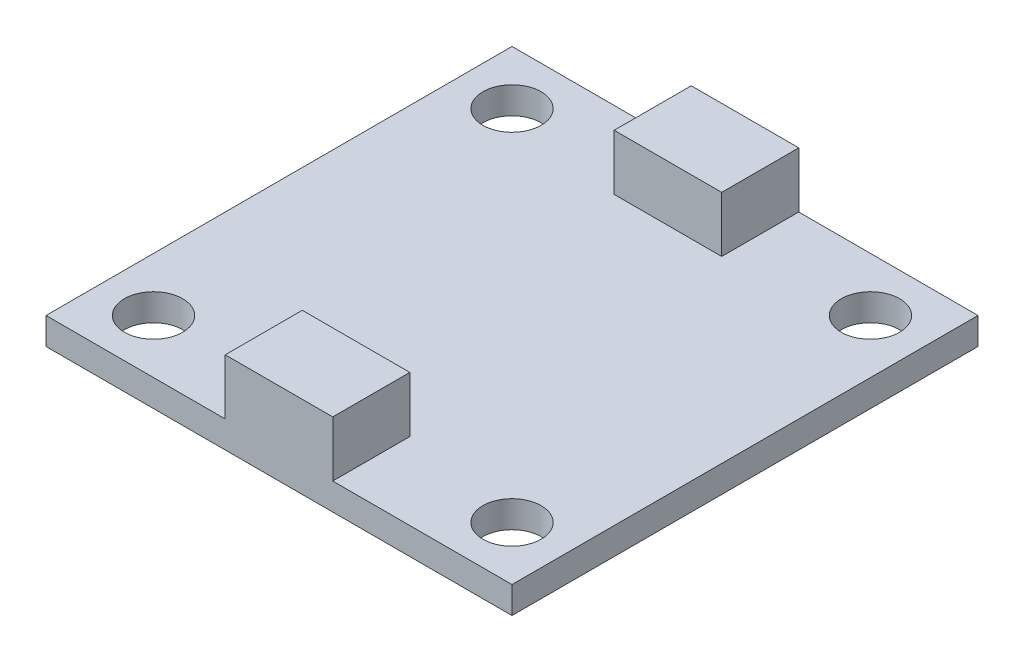
ISO-10303-21;
HEADER;
FILE_DESCRIPTION(('STEP AP214'),'2;1');
FILE_NAME('part.step','',(''),(''),'','','');
FILE_SCHEMA(('AUTOMOTIVE_DESIGN { 1 0 10303 214 1 1 1 1 }'));
ENDSEC;
DATA;
#1=APPLICATION_CONTEXT('core data for automotive mechanical design processes');
#2=APPLICATION_PROTOCOL_DEFINITION('international standard','automotive_design',2000,#1);
#3=PRODUCT_CONTEXT('',#1,'mechanical');
#4=PRODUCT('Part','Part','',(#3));
#5=PRODUCT_RELATED_PRODUCT_CATEGORY('part','',(#4));
#6=PRODUCT_DEFINITION_FORMATION('','',#4);
#7=PRODUCT_DEFINITION_CONTEXT('part definition',#1,'design');
#8=PRODUCT_DEFINITION('design','',#6,#7);
#9=PRODUCT_DEFINITION_SHAPE('','',#8);
#10=(LENGTH_UNIT() NAMED_UNIT(*) SI_UNIT(.MILLI.,.METRE.));
#11=(NAMED_UNIT(*) PLANE_ANGLE_UNIT() SI_UNIT($,.RADIAN.));
#12=(NAMED_UNIT(*) SI_UNIT($,.STERADIAN.) SOLID_ANGLE_UNIT());
#13=UNCERTAINTY_MEASURE_WITH_UNIT(LENGTH_MEASURE(1.E-05),#10,'distance_accuracy_value','');
#14=(GEOMETRIC_REPRESENTATION_CONTEXT(3) GLOBAL_UNCERTAINTY_ASSIGNED_CONTEXT((#13)) GLOBAL_UNIT_ASSIGNED_CONTEXT((#10,
#11,#12)) REPRESENTATION_CONTEXT('',''));
#15=CARTESIAN_POINT('',(0.,0.,0.));
#16=DIRECTION('',(0.,0.,1.));
#17=DIRECTION('',(1.,0.,0.));
#18=AXIS2_PLACEMENT_3D('',#15,#16,#17);
#19=CARTESIAN_POINT('',(0.,1.5,0.));
#20=DIRECTION('',(0.,-1.,0.));
#21=DIRECTION('',(0.,0.,-1.));
#22=AXIS2_PLACEMENT_3D('',#19,#20,#21);
#23=PLANE('',#22);
#24=CARTESIAN_POINT('',(-10.,1.5,10.));
#25=DIRECTION('',(0.,1.,0.));
#26=DIRECTION('',(0.,0.,1.));
#27=AXIS2_PLACEMENT_3D('',#24,#25,#26);
#28=CIRCLE('',#27,1.625);
#29=CARTESIAN_POINT('',(-10.,1.5,11.625));
#30=VERTEX_POINT('',#29);
#31=EDGE_CURVE('E200',#30,#30,#28,.T.);
#32=ORIENTED_EDGE('',*,*,#31,.F.);
#33=EDGE_LOOP('',(#32));
#34=FACE_BOUND('',#33,.T.);
#35=CARTESIAN_POINT('',(10.,1.5,10.));
#36=DIRECTION('',(0.,1.,0.));
#37=DIRECTION('',(0.,0.,1.));
#38=AXIS2_PLACEMENT_3D('',#35,#36,#37);
#39=CIRCLE('',#38,1.625);
#40=CARTESIAN_POINT('',(10.,1.5,11.625));
#41=VERTEX_POINT('',#40);
#42=EDGE_CURVE('E214',#41,#41,#39,.T.);
#43=ORIENTED_EDGE('',*,*,#42,.F.);
#44=EDGE_LOOP('',(#43));
#45=FACE_BOUND('',#44,.T.);
#46=CARTESIAN_POINT('',(10.,1.5,-10.));
#47=DIRECTION('',(0.,1.,0.));
#48=DIRECTION('',(0.,0.,1.));
#49=AXIS2_PLACEMENT_3D('',#46,#47,#48);
#50=CIRCLE('',#49,1.625);
#51=CARTESIAN_POINT('',(10.,1.5,-8.375));
#52=VERTEX_POINT('',#51);
#53=EDGE_CURVE('E206',#52,#52,#50,.T.);
#54=ORIENTED_EDGE('',*,*,#53,.F.);
#55=EDGE_LOOP('',(#54));
#56=FACE_BOUND('',#55,.T.);
#57=CARTESIAN_POINT('',(-10.,1.5,-10.));
#58=DIRECTION('',(0.,1.,0.));
#59=DIRECTION('',(0.,0.,1.));
#60=AXIS2_PLACEMENT_3D('',#57,#58,#59);
#61=CIRCLE('',#60,1.625);
#62=CARTESIAN_POINT('',(-10.,1.5,-8.375));
#63=VERTEX_POINT('',#62);
#64=EDGE_CURVE('E205',#63,#63,#61,.T.);
#65=ORIENTED_EDGE('',*,*,#64,.F.);
#66=EDGE_LOOP('',(#65));
#67=FACE_BOUND('',#66,.T.);
#68=DIRECTION('',(0.,0.,-1.));
#69=VECTOR('',#68,1.);
#70=CARTESIAN_POINT('',(3.,1.5,8.7));
#71=LINE('',#70,#69);
#72=CARTESIAN_POINT('',(3.,1.5,13.));
#73=VERTEX_POINT('',#72);
#74=CARTESIAN_POINT('',(3.,1.5,8.7));
#75=VERTEX_POINT('',#74);
#76=EDGE_CURVE('E151',#73,#75,#71,.T.);
#77=ORIENTED_EDGE('',*,*,#76,.F.);
#78=DIRECTION('',(1.,0.,0.));
#79=VECTOR('',#78,1.);
#80=CARTESIAN_POINT('',(-13.,1.5,13.));
#81=LINE('',#80,#79);
#82=CARTESIAN_POINT('',(13.,1.5,13.));
#83=VERTEX_POINT('',#82);
#84=EDGE_CURVE('E245',#73,#83,#81,.T.);
#85=ORIENTED_EDGE('',*,*,#84,.T.);
#86=DIRECTION('',(0.,0.,-1.));
#87=VECTOR('',#86,1.);
#88=CARTESIAN_POINT('',(13.,1.5,13.));
#89=LINE('',#88,#87);
#90=CARTESIAN_POINT('',(13.,1.5,-13.));
#91=VERTEX_POINT('',#90);
#92=EDGE_CURVE('E233',#83,#91,#89,.T.);
#93=ORIENTED_EDGE('',*,*,#92,.T.);
#94=DIRECTION('',(-1.,0.,0.));
#95=VECTOR('',#94,1.);
#96=CARTESIAN_POINT('',(-13.,1.5,-13.));
#97=LINE('',#96,#95);
#98=CARTESIAN_POINT('',(2.99999999999999,1.5,-13.));
#99=VERTEX_POINT('',#98);
#100=EDGE_CURVE('E239',#91,#99,#97,.T.);
#101=ORIENTED_EDGE('',*,*,#100,.T.);
#102=DIRECTION('',(0.,0.,-1.));
#103=VECTOR('',#102,1.);
#104=CARTESIAN_POINT('',(3.,1.5,-8.7));
#105=LINE('',#104,#103);
#106=CARTESIAN_POINT('',(3.,1.5,-8.7));
#107=VERTEX_POINT('',#106);
#108=EDGE_CURVE('E153',#107,#99,#105,.T.);
#109=ORIENTED_EDGE('',*,*,#108,.F.);
#110=DIRECTION('',(1.,0.,0.));
#111=VECTOR('',#110,1.);
#112=CARTESIAN_POINT('',(-3.,1.5,-8.7));
#113=LINE('',#112,#111);
#114=CARTESIAN_POINT('',(-3.,1.5,-8.7));
#115=VERTEX_POINT('',#114);
#116=EDGE_CURVE('E169',#115,#107,#113,.T.);
#117=ORIENTED_EDGE('',*,*,#116,.F.);
#118=DIRECTION('',(0.,0.,1.));
#119=VECTOR('',#118,1.);
#120=CARTESIAN_POINT('',(-3.,1.5,-8.7));
#121=LINE('',#120,#119);
#122=CARTESIAN_POINT('',(-3.,1.5,-13.));
#123=VERTEX_POINT('',#122);
#124=EDGE_CURVE('E158',#123,#115,#121,.T.);
#125=ORIENTED_EDGE('',*,*,#124,.F.);
#126=CARTESIAN_POINT('',(-13.,1.5,-13.));
#127=VERTEX_POINT('',#126);
#128=EDGE_CURVE('E237',#123,#127,#97,.T.);
#129=ORIENTED_EDGE('',*,*,#128,.T.);
#130=DIRECTION('',(0.,0.,1.));
#131=VECTOR('',#130,1.);
#132=CARTESIAN_POINT('',(-13.,1.5,13.));
#133=LINE('',#132,#131);
#134=CARTESIAN_POINT('',(-13.,1.5,13.));
#135=VERTEX_POINT('',#134);
#136=EDGE_CURVE('E242',#127,#135,#133,.T.);
#137=ORIENTED_EDGE('',*,*,#136,.T.);
#138=CARTESIAN_POINT('',(-3.,1.5,13.));
#139=VERTEX_POINT('',#138);
#140=EDGE_CURVE('E246',#135,#139,#81,.T.);
#141=ORIENTED_EDGE('',*,*,#140,.T.);
#142=DIRECTION('',(0.,0.,1.));
#143=VECTOR('',#142,1.);
#144=CARTESIAN_POINT('',(-3.,1.5,8.7));
#145=LINE('',#144,#143);
#146=CARTESIAN_POINT('',(-3.,1.5,8.7));
#147=VERTEX_POINT('',#146);
#148=EDGE_CURVE('E60',#147,#139,#145,.T.);
#149=ORIENTED_EDGE('',*,*,#148,.F.);
#150=DIRECTION('',(-1.,0.,0.));
#151=VECTOR('',#150,1.);
#152=CARTESIAN_POINT('',(-3.,1.5,8.7));
#153=LINE('',#152,#151);
#154=EDGE_CURVE('E55',#75,#147,#153,.T.);
#155=ORIENTED_EDGE('',*,*,#154,.F.);
#156=EDGE_LOOP('',(#77,#85,#93,#101,#109,#117,#125,#129,#137,#141,#149,#155));
#157=FACE_BOUND('',#156,.T.);
#158=ADVANCED_FACE('F39',(#34,#45,#56,#67,#157),#23,.F.);
#159=CARTESIAN_POINT('',(13.,1.5,13.));
#160=DIRECTION('',(-1.,0.,0.));
#161=DIRECTION('',(0.,0.,1.));
#162=AXIS2_PLACEMENT_3D('',#159,#160,#161);
#163=PLANE('',#162);
#164=DIRECTION('',(0.,0.,-1.));
#165=VECTOR('',#164,1.);
#166=CARTESIAN_POINT('',(13.,0.,13.));
#167=LINE('',#166,#165);
#168=CARTESIAN_POINT('',(13.,0.,13.));
#169=VERTEX_POINT('',#168);
#170=CARTESIAN_POINT('',(13.,0.,-13.));
#171=VERTEX_POINT('',#170);
#172=EDGE_CURVE('E229',#169,#171,#167,.T.);
#173=ORIENTED_EDGE('',*,*,#172,.T.);
#174=DIRECTION('',(0.,-1.,0.));
#175=VECTOR('',#174,1.);
#176=CARTESIAN_POINT('',(13.,1.5,-13.));
#177=LINE('',#176,#175);
#178=EDGE_CURVE('E11',#91,#171,#177,.T.);
#179=ORIENTED_EDGE('',*,*,#178,.F.);
#180=ORIENTED_EDGE('',*,*,#92,.F.);
#181=DIRECTION('',(0.,-1.,0.));
#182=VECTOR('',#181,1.);
#183=CARTESIAN_POINT('',(13.,1.5,13.));
#184=LINE('',#183,#182);
#185=EDGE_CURVE('E249',#83,#169,#184,.T.);
#186=ORIENTED_EDGE('',*,*,#185,.T.);
#187=EDGE_LOOP('',(#173,#179,#180,#186));
#188=FACE_BOUND('',#187,.T.);
#189=ADVANCED_FACE('F41',(#188),#163,.F.);
#190=CARTESIAN_POINT('',(-13.,1.5,-13.));
#191=DIRECTION('',(0.,0.,1.));
#192=DIRECTION('',(1.,0.,0.));
#193=AXIS2_PLACEMENT_3D('',#190,#191,#192);
#194=PLANE('',#193);
#195=DIRECTION('',(-1.,0.,0.));
#196=VECTOR('',#195,1.);
#197=CARTESIAN_POINT('',(-13.,0.,-13.));
#198=LINE('',#197,#196);
#199=CARTESIAN_POINT('',(-13.,0.,-13.));
#200=VERTEX_POINT('',#199);
#201=EDGE_CURVE('E253',#171,#200,#198,.T.);
#202=ORIENTED_EDGE('',*,*,#201,.T.);
#203=DIRECTION('',(0.,-1.,0.));
#204=VECTOR('',#203,1.);
#205=CARTESIAN_POINT('',(-13.,1.5,-13.));
#206=LINE('',#205,#204);
#207=EDGE_CURVE('E48',#127,#200,#206,.T.);
#208=ORIENTED_EDGE('',*,*,#207,.F.);
#209=ORIENTED_EDGE('',*,*,#128,.F.);
#210=DIRECTION('',(0.,-1.,0.));
#211=VECTOR('',#210,1.);
#212=CARTESIAN_POINT('',(-3.,4.6,-13.));
#213=LINE('',#212,#211);
#214=CARTESIAN_POINT('',(-3.,4.6,-13.));
#215=VERTEX_POINT('',#214);
#216=EDGE_CURVE('E192',#215,#123,#213,.T.);
#217=ORIENTED_EDGE('',*,*,#216,.F.);
#218=DIRECTION('',(-1.,0.,0.));
#219=VECTOR('',#218,1.);
#220=CARTESIAN_POINT('',(-3.,4.6,-13.));
#221=LINE('',#220,#219);
#222=CARTESIAN_POINT('',(3.,4.6,-13.));
#223=VERTEX_POINT('',#222);
#224=EDGE_CURVE('E168',#223,#215,#221,.T.);
#225=ORIENTED_EDGE('',*,*,#224,.F.);
#226=DIRECTION('',(0.,-1.,0.));
#227=VECTOR('',#226,1.);
#228=CARTESIAN_POINT('',(3.,4.6,-13.));
#229=LINE('',#228,#227);
#230=EDGE_CURVE('E196',#223,#99,#229,.T.);
#231=ORIENTED_EDGE('',*,*,#230,.T.);
#232=ORIENTED_EDGE('',*,*,#100,.F.);
#233=ORIENTED_EDGE('',*,*,#178,.T.);
#234=EDGE_LOOP('',(#202,#208,#209,#217,#225,#231,#232,#233));
#235=FACE_BOUND('',#234,.T.);
#236=ADVANCED_FACE('F291',(#235),#194,.F.);
#237=CARTESIAN_POINT('',(-13.,1.5,13.));
#238=DIRECTION('',(1.,0.,0.));
#239=DIRECTION('',(0.,0.,-1.));
#240=AXIS2_PLACEMENT_3D('',#237,#238,#239);
#241=PLANE('',#240);
#242=DIRECTION('',(0.,0.,1.));
#243=VECTOR('',#242,1.);
#244=CARTESIAN_POINT('',(-13.,0.,13.));
#245=LINE('',#244,#243);
#246=CARTESIAN_POINT('',(-13.,0.,13.));
#247=VERTEX_POINT('',#246);
#248=EDGE_CURVE('E256',#200,#247,#245,.T.);
#249=ORIENTED_EDGE('',*,*,#248,.T.);
#250=DIRECTION('',(0.,-1.,0.));
#251=VECTOR('',#250,1.);
#252=CARTESIAN_POINT('',(-13.,1.5,13.));
#253=LINE('',#252,#251);
#254=EDGE_CURVE('E264',#135,#247,#253,.T.);
#255=ORIENTED_EDGE('',*,*,#254,.F.);
#256=ORIENTED_EDGE('',*,*,#136,.F.);
#257=ORIENTED_EDGE('',*,*,#207,.T.);
#258=EDGE_LOOP('',(#249,#255,#256,#257));
#259=FACE_BOUND('',#258,.T.);
#260=ADVANCED_FACE('F273',(#259),#241,.F.);
#261=CARTESIAN_POINT('',(-13.,1.5,13.));
#262=DIRECTION('',(0.,0.,-1.));
#263=DIRECTION('',(-1.,0.,0.));
#264=AXIS2_PLACEMENT_3D('',#261,#262,#263);
#265=PLANE('',#264);
#266=DIRECTION('',(1.,0.,0.));
#267=VECTOR('',#266,1.);
#268=CARTESIAN_POINT('',(-13.,0.,13.));
#269=LINE('',#268,#267);
#270=EDGE_CURVE('E238',#247,#169,#269,.T.);
#271=ORIENTED_EDGE('',*,*,#270,.T.);
#272=ORIENTED_EDGE('',*,*,#185,.F.);
#273=ORIENTED_EDGE('',*,*,#84,.F.);
#274=DIRECTION('',(0.,-1.,0.));
#275=VECTOR('',#274,1.);
#276=CARTESIAN_POINT('',(3.,4.6,13.));
#277=LINE('',#276,#275);
#278=CARTESIAN_POINT('',(3.,4.6,13.));
#279=VERTEX_POINT('',#278);
#280=EDGE_CURVE('E441',#279,#73,#277,.T.);
#281=ORIENTED_EDGE('',*,*,#280,.F.);
#282=DIRECTION('',(1.,0.,0.));
#283=VECTOR('',#282,1.);
#284=CARTESIAN_POINT('',(-3.,4.6,13.));
#285=LINE('',#284,#283);
#286=CARTESIAN_POINT('',(-3.,4.6,13.));
#287=VERTEX_POINT('',#286);
#288=EDGE_CURVE('E144',#287,#279,#285,.T.);
#289=ORIENTED_EDGE('',*,*,#288,.F.);
#290=DIRECTION('',(0.,-1.,0.));
#291=VECTOR('',#290,1.);
#292=CARTESIAN_POINT('',(-3.,4.6,13.));
#293=LINE('',#292,#291);
#294=EDGE_CURVE('E160',#287,#139,#293,.T.);
#295=ORIENTED_EDGE('',*,*,#294,.T.);
#296=ORIENTED_EDGE('',*,*,#140,.F.);
#297=ORIENTED_EDGE('',*,*,#254,.T.);
#298=EDGE_LOOP('',(#271,#272,#273,#281,#289,#295,#296,#297));
#299=FACE_BOUND('',#298,.T.);
#300=ADVANCED_FACE('F283',(#299),#265,.F.);
#301=CARTESIAN_POINT('',(0.,0.,0.));
#302=DIRECTION('',(0.,-1.,0.));
#303=DIRECTION('',(0.,0.,-1.));
#304=AXIS2_PLACEMENT_3D('',#301,#302,#303);
#305=PLANE('',#304);
#306=CARTESIAN_POINT('',(-10.,0.,10.));
#307=DIRECTION('',(0.,1.,0.));
#308=DIRECTION('',(0.,0.,1.));
#309=AXIS2_PLACEMENT_3D('',#306,#307,#308);
#310=CIRCLE('',#309,1.625);
#311=CARTESIAN_POINT('',(-10.,0.,11.625));
#312=VERTEX_POINT('',#311);
#313=EDGE_CURVE('E218',#312,#312,#310,.T.);
#314=ORIENTED_EDGE('',*,*,#313,.T.);
#315=EDGE_LOOP('',(#314));
#316=FACE_BOUND('',#315,.T.);
#317=CARTESIAN_POINT('',(10.,0.,10.));
#318=DIRECTION('',(0.,1.,0.));
#319=DIRECTION('',(0.,0.,1.));
#320=AXIS2_PLACEMENT_3D('',#317,#318,#319);
#321=CIRCLE('',#320,1.625);
#322=CARTESIAN_POINT('',(10.,0.,11.625));
#323=VERTEX_POINT('',#322);
#324=EDGE_CURVE('E210',#323,#323,#321,.T.);
#325=ORIENTED_EDGE('',*,*,#324,.T.);
#326=EDGE_LOOP('',(#325));
#327=FACE_BOUND('',#326,.T.);
#328=CARTESIAN_POINT('',(10.,0.,-10.));
#329=DIRECTION('',(0.,1.,0.));
#330=DIRECTION('',(0.,0.,1.));
#331=AXIS2_PLACEMENT_3D('',#328,#329,#330);
#332=CIRCLE('',#331,1.625);
#333=CARTESIAN_POINT('',(10.,0.,-8.375));
#334=VERTEX_POINT('',#333);
#335=EDGE_CURVE('E201',#334,#334,#332,.T.);
#336=ORIENTED_EDGE('',*,*,#335,.T.);
#337=EDGE_LOOP('',(#336));
#338=FACE_BOUND('',#337,.T.);
#339=CARTESIAN_POINT('',(-10.,0.,-10.));
#340=DIRECTION('',(0.,1.,0.));
#341=DIRECTION('',(0.,0.,1.));
#342=AXIS2_PLACEMENT_3D('',#339,#340,#341);
#343=CIRCLE('',#342,1.625);
#344=CARTESIAN_POINT('',(-10.,0.,-8.375));
#345=VERTEX_POINT('',#344);
#346=EDGE_CURVE('E225',#345,#345,#343,.T.);
#347=ORIENTED_EDGE('',*,*,#346,.T.);
#348=EDGE_LOOP('',(#347));
#349=FACE_BOUND('',#348,.T.);
#350=ORIENTED_EDGE('',*,*,#172,.F.);
#351=ORIENTED_EDGE('',*,*,#270,.F.);
#352=ORIENTED_EDGE('',*,*,#248,.F.);
#353=ORIENTED_EDGE('',*,*,#201,.F.);
#354=EDGE_LOOP('',(#350,#351,#352,#353));
#355=FACE_BOUND('',#354,.T.);
#356=ADVANCED_FACE('F280',(#316,#327,#338,#349,#355),#305,.T.);
#357=CARTESIAN_POINT('',(-10.,0.,-10.));
#358=DIRECTION('',(0.,1.,0.));
#359=DIRECTION('',(0.,0.,1.));
#360=AXIS2_PLACEMENT_3D('',#357,#358,#359);
#361=CYLINDRICAL_SURFACE('',#360,1.625);
#362=ORIENTED_EDGE('',*,*,#346,.F.);
#363=EDGE_LOOP('',(#362));
#364=FACE_BOUND('',#363,.T.);
#365=ORIENTED_EDGE('',*,*,#64,.T.);
#366=EDGE_LOOP('',(#365));
#367=FACE_BOUND('',#366,.T.);
#368=ADVANCED_FACE('F324',(#364,#367),#361,.F.);
#369=CARTESIAN_POINT('',(10.,0.,-10.));
#370=DIRECTION('',(0.,1.,0.));
#371=DIRECTION('',(0.,0.,1.));
#372=AXIS2_PLACEMENT_3D('',#369,#370,#371);
#373=CYLINDRICAL_SURFACE('',#372,1.625);
#374=ORIENTED_EDGE('',*,*,#335,.F.);
#375=EDGE_LOOP('',(#374));
#376=FACE_BOUND('',#375,.T.);
#377=ORIENTED_EDGE('',*,*,#53,.T.);
#378=EDGE_LOOP('',(#377));
#379=FACE_BOUND('',#378,.T.);
#380=ADVANCED_FACE('F356',(#376,#379),#373,.F.);
#381=CARTESIAN_POINT('',(10.,0.,10.));
#382=DIRECTION('',(0.,1.,0.));
#383=DIRECTION('',(0.,0.,1.));
#384=AXIS2_PLACEMENT_3D('',#381,#382,#383);
#385=CYLINDRICAL_SURFACE('',#384,1.625);
#386=ORIENTED_EDGE('',*,*,#324,.F.);
#387=EDGE_LOOP('',(#386));
#388=FACE_BOUND('',#387,.T.);
#389=ORIENTED_EDGE('',*,*,#42,.T.);
#390=EDGE_LOOP('',(#389));
#391=FACE_BOUND('',#390,.T.);
#392=ADVANCED_FACE('F363',(#388,#391),#385,.F.);
#393=CARTESIAN_POINT('',(-10.,0.,10.));
#394=DIRECTION('',(0.,1.,0.));
#395=DIRECTION('',(0.,0.,1.));
#396=AXIS2_PLACEMENT_3D('',#393,#394,#395);
#397=CYLINDRICAL_SURFACE('',#396,1.625);
#398=ORIENTED_EDGE('',*,*,#313,.F.);
#399=EDGE_LOOP('',(#398));
#400=FACE_BOUND('',#399,.T.);
#401=ORIENTED_EDGE('',*,*,#31,.T.);
#402=EDGE_LOOP('',(#401));
#403=FACE_BOUND('',#402,.T.);
#404=ADVANCED_FACE('F371',(#400,#403),#397,.F.);
#405=CARTESIAN_POINT('',(3.,4.6,-8.7));
#406=DIRECTION('',(-1.,0.,0.));
#407=DIRECTION('',(0.,0.,1.));
#408=AXIS2_PLACEMENT_3D('',#405,#406,#407);
#409=PLANE('',#408);
#410=ORIENTED_EDGE('',*,*,#108,.T.);
#411=ORIENTED_EDGE('',*,*,#230,.F.);
#412=DIRECTION('',(0.,0.,-1.));
#413=VECTOR('',#412,1.);
#414=CARTESIAN_POINT('',(3.,4.6,-8.7));
#415=LINE('',#414,#413);
#416=CARTESIAN_POINT('',(3.,4.6,-8.7));
#417=VERTEX_POINT('',#416);
#418=EDGE_CURVE('E164',#417,#223,#415,.T.);
#419=ORIENTED_EDGE('',*,*,#418,.F.);
#420=DIRECTION('',(0.,-1.,0.));
#421=VECTOR('',#420,1.);
#422=CARTESIAN_POINT('',(3.,4.6,-8.7));
#423=LINE('',#422,#421);
#424=EDGE_CURVE('E177',#417,#107,#423,.T.);
#425=ORIENTED_EDGE('',*,*,#424,.T.);
#426=EDGE_LOOP('',(#410,#411,#419,#425));
#427=FACE_BOUND('',#426,.T.);
#428=ADVANCED_FACE('F303',(#427),#409,.F.);
#429=CARTESIAN_POINT('',(-3.,4.6,-8.7));
#430=DIRECTION('',(1.,0.,0.));
#431=DIRECTION('',(0.,0.,-1.));
#432=AXIS2_PLACEMENT_3D('',#429,#430,#431);
#433=PLANE('',#432);
#434=ORIENTED_EDGE('',*,*,#124,.T.);
#435=DIRECTION('',(0.,-1.,0.));
#436=VECTOR('',#435,1.);
#437=CARTESIAN_POINT('',(-3.,4.6,-8.7));
#438=LINE('',#437,#436);
#439=CARTESIAN_POINT('',(-3.,4.6,-8.7));
#440=VERTEX_POINT('',#439);
#441=EDGE_CURVE('E188',#440,#115,#438,.T.);
#442=ORIENTED_EDGE('',*,*,#441,.F.);
#443=DIRECTION('',(0.,0.,1.));
#444=VECTOR('',#443,1.);
#445=CARTESIAN_POINT('',(-3.,4.6,-8.7));
#446=LINE('',#445,#444);
#447=EDGE_CURVE('E172',#215,#440,#446,.T.);
#448=ORIENTED_EDGE('',*,*,#447,.F.);
#449=ORIENTED_EDGE('',*,*,#216,.T.);
#450=EDGE_LOOP('',(#434,#442,#448,#449));
#451=FACE_BOUND('',#450,.T.);
#452=ADVANCED_FACE('F294',(#451),#433,.F.);
#453=CARTESIAN_POINT('',(-3.,4.6,-8.7));
#454=DIRECTION('',(0.,0.,-1.));
#455=DIRECTION('',(-1.,0.,0.));
#456=AXIS2_PLACEMENT_3D('',#453,#454,#455);
#457=PLANE('',#456);
#458=ORIENTED_EDGE('',*,*,#116,.T.);
#459=ORIENTED_EDGE('',*,*,#424,.F.);
#460=DIRECTION('',(1.,0.,0.));
#461=VECTOR('',#460,1.);
#462=CARTESIAN_POINT('',(-3.,4.6,-8.7));
#463=LINE('',#462,#461);
#464=EDGE_CURVE('E175',#440,#417,#463,.T.);
#465=ORIENTED_EDGE('',*,*,#464,.F.);
#466=ORIENTED_EDGE('',*,*,#441,.T.);
#467=EDGE_LOOP('',(#458,#459,#465,#466));
#468=FACE_BOUND('',#467,.T.);
#469=ADVANCED_FACE('F305',(#468),#457,.F.);
#470=CARTESIAN_POINT('',(0.,4.6,0.));
#471=DIRECTION('',(0.,-1.,0.));
#472=DIRECTION('',(0.,0.,-1.));
#473=AXIS2_PLACEMENT_3D('',#470,#471,#472);
#474=PLANE('',#473);
#475=ORIENTED_EDGE('',*,*,#418,.T.);
#476=ORIENTED_EDGE('',*,*,#224,.T.);
#477=ORIENTED_EDGE('',*,*,#447,.T.);
#478=ORIENTED_EDGE('',*,*,#464,.T.);
#479=EDGE_LOOP('',(#475,#476,#477,#478));
#480=FACE_BOUND('',#479,.T.);
#481=ADVANCED_FACE('F298',(#480),#474,.F.);
#482=CARTESIAN_POINT('',(3.,4.6,8.7));
#483=DIRECTION('',(-1.,0.,0.));
#484=DIRECTION('',(0.,0.,1.));
#485=AXIS2_PLACEMENT_3D('',#482,#483,#484);
#486=PLANE('',#485);
#487=ORIENTED_EDGE('',*,*,#76,.T.);
#488=DIRECTION('',(0.,-1.,0.));
#489=VECTOR('',#488,1.);
#490=CARTESIAN_POINT('',(3.,4.6,8.7));
#491=LINE('',#490,#489);
#492=CARTESIAN_POINT('',(3.,4.6,8.7));
#493=VERTEX_POINT('',#492);
#494=EDGE_CURVE('E131',#493,#75,#491,.T.);
#495=ORIENTED_EDGE('',*,*,#494,.F.);
#496=DIRECTION('',(0.,0.,-1.));
#497=VECTOR('',#496,1.);
#498=CARTESIAN_POINT('',(3.,4.6,8.7));
#499=LINE('',#498,#497);
#500=EDGE_CURVE('E139',#279,#493,#499,.T.);
#501=ORIENTED_EDGE('',*,*,#500,.F.);
#502=ORIENTED_EDGE('',*,*,#280,.T.);
#503=EDGE_LOOP('',(#487,#495,#501,#502));
#504=FACE_BOUND('',#503,.T.);
#505=ADVANCED_FACE('F150',(#504),#486,.F.);
#506=CARTESIAN_POINT('',(-3.,4.6,8.7));
#507=DIRECTION('',(0.,0.,1.));
#508=DIRECTION('',(1.,0.,0.));
#509=AXIS2_PLACEMENT_3D('',#506,#507,#508);
#510=PLANE('',#509);
#511=ORIENTED_EDGE('',*,*,#154,.T.);
#512=DIRECTION('',(0.,-1.,0.));
#513=VECTOR('',#512,1.);
#514=CARTESIAN_POINT('',(-3.,4.6,8.7));
#515=LINE('',#514,#513);
#516=CARTESIAN_POINT('',(-3.,4.6,8.7));
#517=VERTEX_POINT('',#516);
#518=EDGE_CURVE('E134',#517,#147,#515,.T.);
#519=ORIENTED_EDGE('',*,*,#518,.F.);
#520=DIRECTION('',(-1.,0.,0.));
#521=VECTOR('',#520,1.);
#522=CARTESIAN_POINT('',(-3.,4.6,8.7));
#523=LINE('',#522,#521);
#524=EDGE_CURVE('E127',#493,#517,#523,.T.);
#525=ORIENTED_EDGE('',*,*,#524,.F.);
#526=ORIENTED_EDGE('',*,*,#494,.T.);
#527=EDGE_LOOP('',(#511,#519,#525,#526));
#528=FACE_BOUND('',#527,.T.);
#529=ADVANCED_FACE('F129',(#528),#510,.F.);
#530=CARTESIAN_POINT('',(-3.,4.6,8.7));
#531=DIRECTION('',(1.,0.,0.));
#532=DIRECTION('',(0.,0.,-1.));
#533=AXIS2_PLACEMENT_3D('',#530,#531,#532);
#534=PLANE('',#533);
#535=ORIENTED_EDGE('',*,*,#148,.T.);
#536=ORIENTED_EDGE('',*,*,#294,.F.);
#537=DIRECTION('',(0.,0.,1.));
#538=VECTOR('',#537,1.);
#539=CARTESIAN_POINT('',(-3.,4.6,8.7));
#540=LINE('',#539,#538);
#541=EDGE_CURVE('E138',#517,#287,#540,.T.);
#542=ORIENTED_EDGE('',*,*,#541,.F.);
#543=ORIENTED_EDGE('',*,*,#518,.T.);
#544=EDGE_LOOP('',(#535,#536,#542,#543));
#545=FACE_BOUND('',#544,.T.);
#546=ADVANCED_FACE('F415',(#545),#534,.F.);
#547=CARTESIAN_POINT('',(0.,4.6,0.));
#548=DIRECTION('',(0.,1.,0.));
#549=DIRECTION('',(0.,0.,1.));
#550=AXIS2_PLACEMENT_3D('',#547,#548,#549);
#551=PLANE('',#550);
#552=ORIENTED_EDGE('',*,*,#500,.T.);
#553=ORIENTED_EDGE('',*,*,#524,.T.);
#554=ORIENTED_EDGE('',*,*,#541,.T.);
#555=ORIENTED_EDGE('',*,*,#288,.T.);
#556=EDGE_LOOP('',(#552,#553,#554,#555));
#557=FACE_BOUND('',#556,.T.);
#558=ADVANCED_FACE('F142',(#557),#551,.T.);
#559=CLOSED_SHELL('',(#158,#189,#236,#260,#300,#356,#368,#380,#392,#404,#428,#452,#469,#481,
#505,#529,#546,#558));
#560=MANIFOLD_SOLID_BREP('B2',#559);
#561=ADVANCED_BREP_SHAPE_REPRESENTATION('',(#18,#560),#14);
#562=SHAPE_DEFINITION_REPRESENTATION(#9,#561);
ENDSEC;
END-ISO-10303-21;
